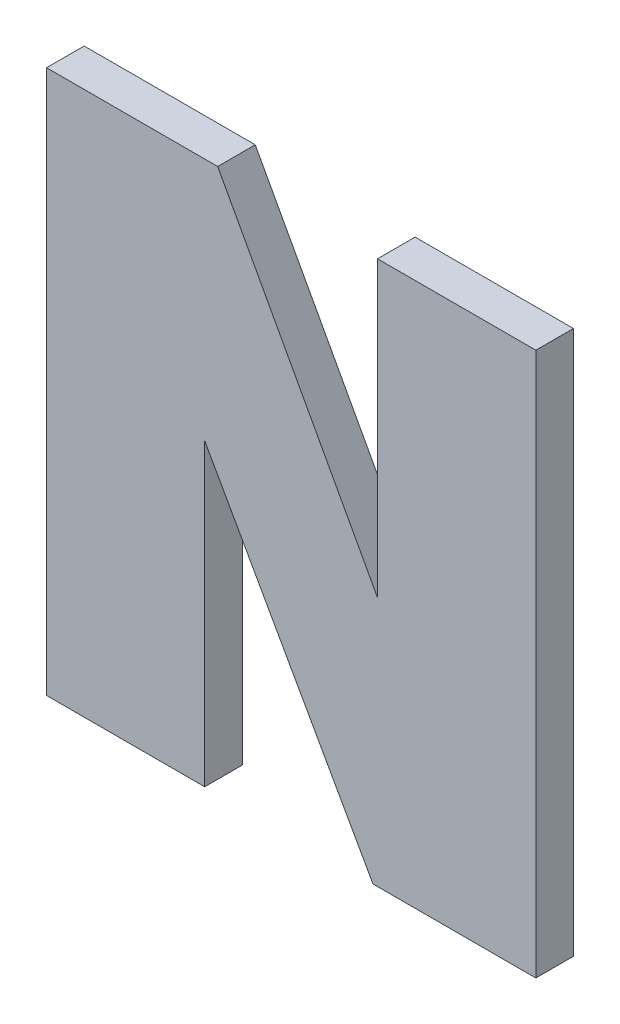
ISO-10303-21;
HEADER;
FILE_DESCRIPTION(('STEP AP214'),'2;1');
FILE_NAME('part.step','',(''),(''),'','','');
FILE_SCHEMA(('AUTOMOTIVE_DESIGN { 1 0 10303 214 1 1 1 1 }'));
ENDSEC;
DATA;
#1=APPLICATION_CONTEXT('core data for automotive mechanical design processes');
#2=APPLICATION_PROTOCOL_DEFINITION('international standard','automotive_design',2000,#1);
#3=PRODUCT_CONTEXT('',#1,'mechanical');
#4=PRODUCT('Part','Part','',(#3));
#5=PRODUCT_RELATED_PRODUCT_CATEGORY('part','',(#4));
#6=PRODUCT_DEFINITION_FORMATION('','',#4);
#7=PRODUCT_DEFINITION_CONTEXT('part definition',#1,'design');
#8=PRODUCT_DEFINITION('design','',#6,#7);
#9=PRODUCT_DEFINITION_SHAPE('','',#8);
#10=(LENGTH_UNIT() NAMED_UNIT(*) SI_UNIT(.MILLI.,.METRE.));
#11=(NAMED_UNIT(*) PLANE_ANGLE_UNIT() SI_UNIT($,.RADIAN.));
#12=(NAMED_UNIT(*) SI_UNIT($,.STERADIAN.) SOLID_ANGLE_UNIT());
#13=UNCERTAINTY_MEASURE_WITH_UNIT(LENGTH_MEASURE(1.E-05),#10,'distance_accuracy_value','');
#14=(GEOMETRIC_REPRESENTATION_CONTEXT(3) GLOBAL_UNCERTAINTY_ASSIGNED_CONTEXT((#13)) GLOBAL_UNIT_ASSIGNED_CONTEXT((#10,
#11,#12)) REPRESENTATION_CONTEXT('',''));
#15=CARTESIAN_POINT('',(0.,0.,0.));
#16=DIRECTION('',(0.,0.,1.));
#17=DIRECTION('',(1.,0.,0.));
#18=AXIS2_PLACEMENT_3D('',#15,#16,#17);
#19=CARTESIAN_POINT('',(0.,0.,0.));
#20=DIRECTION('',(0.,0.,1.));
#21=DIRECTION('',(1.,0.,0.));
#22=AXIS2_PLACEMENT_3D('',#19,#20,#21);
#23=PLANE('',#22);
#24=DIRECTION('',(0.,1.,0.));
#25=VECTOR('',#24,1.);
#26=CARTESIAN_POINT('',(6.367018,0.654558,0.));
#27=LINE('',#26,#25);
#28=CARTESIAN_POINT('',(6.367018,0.654558,0.));
#29=VERTEX_POINT('',#28);
#30=CARTESIAN_POINT('',(6.367018,1.377696,0.));
#31=VERTEX_POINT('',#30);
#32=EDGE_CURVE('E140',#29,#31,#27,.T.);
#33=ORIENTED_EDGE('',*,*,#32,.F.);
#34=DIRECTION('',(1.,0.,0.));
#35=VECTOR('',#34,1.);
#36=CARTESIAN_POINT('',(6.150356,0.654558,0.));
#37=LINE('',#36,#35);
#38=CARTESIAN_POINT('',(6.15035599999994,0.654557999999966,0.));
#39=VERTEX_POINT('',#38);
#40=EDGE_CURVE('E135',#39,#29,#37,.T.);
#41=ORIENTED_EDGE('',*,*,#40,.F.);
#42=DIRECTION('',(0.489542236970215,-0.871979585897627,0.));
#43=VECTOR('',#42,1.);
#44=CARTESIAN_POINT('',(5.926582,1.053147427262,0.));
#45=LINE('',#44,#43);
#46=CARTESIAN_POINT('',(5.926582,1.053147427262,0.));
#47=VERTEX_POINT('',#46);
#48=EDGE_CURVE('E130',#47,#39,#45,.T.);
#49=ORIENTED_EDGE('',*,*,#48,.F.);
#50=DIRECTION('',(0.,1.,0.));
#51=VECTOR('',#50,1.);
#52=CARTESIAN_POINT('',(5.926582,0.654558,0.));
#53=LINE('',#52,#51);
#54=CARTESIAN_POINT('',(5.926582,0.654558,0.));
#55=VERTEX_POINT('',#54);
#56=EDGE_CURVE('E125',#55,#47,#53,.T.);
#57=ORIENTED_EDGE('',*,*,#56,.F.);
#58=DIRECTION('',(1.,0.,0.));
#59=VECTOR('',#58,1.);
#60=CARTESIAN_POINT('',(5.71627,0.654558,0.));
#61=LINE('',#60,#59);
#62=CARTESIAN_POINT('',(5.71627,0.654558,0.));
#63=VERTEX_POINT('',#62);
#64=EDGE_CURVE('E120',#63,#55,#61,.T.);
#65=ORIENTED_EDGE('',*,*,#64,.F.);
#66=DIRECTION('',(0.,1.,0.));
#67=VECTOR('',#66,1.);
#68=CARTESIAN_POINT('',(5.71627,1.377696,0.));
#69=LINE('',#68,#67);
#70=CARTESIAN_POINT('',(5.71627,1.377696,0.));
#71=VERTEX_POINT('',#70);
#72=EDGE_CURVE('E106',#71,#63,#69,.F.);
#73=ORIENTED_EDGE('',*,*,#72,.F.);
#74=DIRECTION('',(1.,0.,0.));
#75=VECTOR('',#74,1.);
#76=CARTESIAN_POINT('',(5.943854,1.377696,0.));
#77=LINE('',#76,#75);
#78=CARTESIAN_POINT('',(5.94385400000002,1.37769600000001,0.));
#79=VERTEX_POINT('',#78);
#80=EDGE_CURVE('E91',#79,#71,#77,.F.);
#81=ORIENTED_EDGE('',*,*,#80,.F.);
#82=DIRECTION('',(-0.478286793407982,0.878203702594967,0.));
#83=VECTOR('',#82,1.);
#84=CARTESIAN_POINT('',(6.156452,0.9873353349398,0.));
#85=LINE('',#84,#83);
#86=CARTESIAN_POINT('',(6.156452,0.9873353349398,0.));
#87=VERTEX_POINT('',#86);
#88=EDGE_CURVE('E20',#87,#79,#85,.T.);
#89=ORIENTED_EDGE('',*,*,#88,.F.);
#90=DIRECTION('',(0.,1.,0.));
#91=VECTOR('',#90,1.);
#92=CARTESIAN_POINT('',(6.156452,1.377696,0.));
#93=LINE('',#92,#91);
#94=CARTESIAN_POINT('',(6.156452,1.377696,0.));
#95=VERTEX_POINT('',#94);
#96=EDGE_CURVE('E149',#95,#87,#93,.F.);
#97=ORIENTED_EDGE('',*,*,#96,.F.);
#98=DIRECTION('',(1.,0.,0.));
#99=VECTOR('',#98,1.);
#100=CARTESIAN_POINT('',(6.367018,1.377696,0.));
#101=LINE('',#100,#99);
#102=EDGE_CURVE('E145',#31,#95,#101,.F.);
#103=ORIENTED_EDGE('',*,*,#102,.F.);
#104=EDGE_LOOP('',(#33,#41,#49,#57,#65,#73,#81,#89,#97,#103));
#105=FACE_BOUND('',#104,.T.);
#106=ADVANCED_FACE('F17',(#105),#23,.F.);
#107=CARTESIAN_POINT('',(6.156452,0.9873353349398,0.));
#108=DIRECTION('',(0.878203702594967,0.478286793407982,0.));
#109=DIRECTION('',(-0.478286793407982,0.878203702594967,0.));
#110=AXIS2_PLACEMENT_3D('',#107,#108,#109);
#111=PLANE('',#110);
#112=DIRECTION('',(0.,0.,1.));
#113=VECTOR('',#112,1.);
#114=CARTESIAN_POINT('',(6.156452,0.9873353349398,0.));
#115=LINE('',#114,#113);
#116=CARTESIAN_POINT('',(6.156452,0.9873353349398,0.05));
#117=VERTEX_POINT('',#116);
#118=EDGE_CURVE('E100',#87,#117,#115,.T.);
#119=ORIENTED_EDGE('',*,*,#118,.F.);
#120=ORIENTED_EDGE('',*,*,#88,.T.);
#121=DIRECTION('',(0.,0.,1.));
#122=VECTOR('',#121,1.);
#123=CARTESIAN_POINT('',(5.943854,1.377696,0.));
#124=LINE('',#123,#122);
#125=CARTESIAN_POINT('',(5.94385400000002,1.37769600000001,0.05));
#126=VERTEX_POINT('',#125);
#127=EDGE_CURVE('E97',#126,#79,#124,.F.);
#128=ORIENTED_EDGE('',*,*,#127,.F.);
#129=DIRECTION('',(-0.47828679340805,0.878203702594931,0.));
#130=VECTOR('',#129,1.);
#131=CARTESIAN_POINT('',(6.156452,0.9873353349398,0.05));
#132=LINE('',#131,#130);
#133=EDGE_CURVE('E151',#117,#126,#132,.T.);
#134=ORIENTED_EDGE('',*,*,#133,.F.);
#135=EDGE_LOOP('',(#119,#120,#128,#134));
#136=FACE_BOUND('',#135,.T.);
#137=ADVANCED_FACE('F96',(#136),#111,.T.);
#138=CARTESIAN_POINT('',(5.943854,1.377696,0.));
#139=DIRECTION('',(0.,1.,0.));
#140=DIRECTION('',(0.,0.,1.));
#141=AXIS2_PLACEMENT_3D('',#138,#139,#140);
#142=PLANE('',#141);
#143=ORIENTED_EDGE('',*,*,#127,.T.);
#144=ORIENTED_EDGE('',*,*,#80,.T.);
#145=DIRECTION('',(0.,0.,1.));
#146=VECTOR('',#145,1.);
#147=CARTESIAN_POINT('',(5.71627,1.377696,0.));
#148=LINE('',#147,#146);
#149=CARTESIAN_POINT('',(5.71627,1.377696,0.05));
#150=VERTEX_POINT('',#149);
#151=EDGE_CURVE('E108',#150,#71,#148,.F.);
#152=ORIENTED_EDGE('',*,*,#151,.F.);
#153=DIRECTION('',(1.,0.,0.));
#154=VECTOR('',#153,1.);
#155=CARTESIAN_POINT('',(0.,1.377696,0.05));
#156=LINE('',#155,#154);
#157=EDGE_CURVE('E112',#126,#150,#156,.F.);
#158=ORIENTED_EDGE('',*,*,#157,.F.);
#159=EDGE_LOOP('',(#143,#144,#152,#158));
#160=FACE_BOUND('',#159,.T.);
#161=ADVANCED_FACE('F110',(#160),#142,.T.);
#162=CARTESIAN_POINT('',(5.71627,1.377696,0.));
#163=DIRECTION('',(-1.,0.,0.));
#164=DIRECTION('',(0.,0.,1.));
#165=AXIS2_PLACEMENT_3D('',#162,#163,#164);
#166=PLANE('',#165);
#167=ORIENTED_EDGE('',*,*,#151,.T.);
#168=ORIENTED_EDGE('',*,*,#72,.T.);
#169=DIRECTION('',(0.,0.,-1.));
#170=VECTOR('',#169,1.);
#171=CARTESIAN_POINT('',(5.71627,0.654558,0.));
#172=LINE('',#171,#170);
#173=CARTESIAN_POINT('',(5.71627,0.654558,0.05));
#174=VERTEX_POINT('',#173);
#175=EDGE_CURVE('E117',#174,#63,#172,.T.);
#176=ORIENTED_EDGE('',*,*,#175,.F.);
#177=DIRECTION('',(0.,1.,0.));
#178=VECTOR('',#177,1.);
#179=CARTESIAN_POINT('',(5.71627,0.,0.05));
#180=LINE('',#179,#178);
#181=EDGE_CURVE('E154',#150,#174,#180,.F.);
#182=ORIENTED_EDGE('',*,*,#181,.F.);
#183=EDGE_LOOP('',(#167,#168,#176,#182));
#184=FACE_BOUND('',#183,.T.);
#185=ADVANCED_FACE('F210',(#184),#166,.T.);
#186=CARTESIAN_POINT('',(5.71627,0.654558,0.));
#187=DIRECTION('',(0.,-1.,0.));
#188=DIRECTION('',(0.,0.,-1.));
#189=AXIS2_PLACEMENT_3D('',#186,#187,#188);
#190=PLANE('',#189);
#191=ORIENTED_EDGE('',*,*,#175,.T.);
#192=ORIENTED_EDGE('',*,*,#64,.T.);
#193=DIRECTION('',(0.,0.,-1.));
#194=VECTOR('',#193,1.);
#195=CARTESIAN_POINT('',(5.926582,0.654558,0.));
#196=LINE('',#195,#194);
#197=CARTESIAN_POINT('',(5.926582,0.654558,0.05));
#198=VERTEX_POINT('',#197);
#199=EDGE_CURVE('E122',#198,#55,#196,.T.);
#200=ORIENTED_EDGE('',*,*,#199,.F.);
#201=DIRECTION('',(1.,0.,0.));
#202=VECTOR('',#201,1.);
#203=CARTESIAN_POINT('',(0.,0.654558,0.05));
#204=LINE('',#203,#202);
#205=EDGE_CURVE('E157',#174,#198,#204,.T.);
#206=ORIENTED_EDGE('',*,*,#205,.F.);
#207=EDGE_LOOP('',(#191,#192,#200,#206));
#208=FACE_BOUND('',#207,.T.);
#209=ADVANCED_FACE('F206',(#208),#190,.T.);
#210=CARTESIAN_POINT('',(5.926582,0.654558,0.));
#211=DIRECTION('',(1.,0.,0.));
#212=DIRECTION('',(0.,0.,-1.));
#213=AXIS2_PLACEMENT_3D('',#210,#211,#212);
#214=PLANE('',#213);
#215=ORIENTED_EDGE('',*,*,#199,.T.);
#216=ORIENTED_EDGE('',*,*,#56,.T.);
#217=DIRECTION('',(0.,0.,1.));
#218=VECTOR('',#217,1.);
#219=CARTESIAN_POINT('',(5.926582,1.053147427262,0.));
#220=LINE('',#219,#218);
#221=CARTESIAN_POINT('',(5.926582,1.053147427262,0.05));
#222=VERTEX_POINT('',#221);
#223=EDGE_CURVE('E127',#222,#47,#220,.F.);
#224=ORIENTED_EDGE('',*,*,#223,.F.);
#225=DIRECTION('',(0.,1.,0.));
#226=VECTOR('',#225,1.);
#227=CARTESIAN_POINT('',(5.926582,0.,0.05));
#228=LINE('',#227,#226);
#229=EDGE_CURVE('E160',#198,#222,#228,.T.);
#230=ORIENTED_EDGE('',*,*,#229,.F.);
#231=EDGE_LOOP('',(#215,#216,#224,#230));
#232=FACE_BOUND('',#231,.T.);
#233=ADVANCED_FACE('F202',(#232),#214,.T.);
#234=CARTESIAN_POINT('',(5.926582,1.053147427262,0.));
#235=DIRECTION('',(-0.871979585897627,-0.489542236970215,0.));
#236=DIRECTION('',(0.489542236970215,-0.871979585897627,0.));
#237=AXIS2_PLACEMENT_3D('',#234,#235,#236);
#238=PLANE('',#237);
#239=ORIENTED_EDGE('',*,*,#223,.T.);
#240=ORIENTED_EDGE('',*,*,#48,.T.);
#241=DIRECTION('',(0.,0.,-1.));
#242=VECTOR('',#241,1.);
#243=CARTESIAN_POINT('',(6.150356,0.654558,0.));
#244=LINE('',#243,#242);
#245=CARTESIAN_POINT('',(6.15035599999994,0.654557999999966,0.05));
#246=VERTEX_POINT('',#245);
#247=EDGE_CURVE('E132',#246,#39,#244,.T.);
#248=ORIENTED_EDGE('',*,*,#247,.F.);
#249=DIRECTION('',(0.489542236970483,-0.871979585897477,0.));
#250=VECTOR('',#249,1.);
#251=CARTESIAN_POINT('',(5.926582,1.053147427262,0.05));
#252=LINE('',#251,#250);
#253=EDGE_CURVE('E163',#222,#246,#252,.T.);
#254=ORIENTED_EDGE('',*,*,#253,.F.);
#255=EDGE_LOOP('',(#239,#240,#248,#254));
#256=FACE_BOUND('',#255,.T.);
#257=ADVANCED_FACE('F198',(#256),#238,.T.);
#258=CARTESIAN_POINT('',(6.150356,0.654558,0.));
#259=DIRECTION('',(0.,-1.,0.));
#260=DIRECTION('',(0.,0.,-1.));
#261=AXIS2_PLACEMENT_3D('',#258,#259,#260);
#262=PLANE('',#261);
#263=ORIENTED_EDGE('',*,*,#247,.T.);
#264=ORIENTED_EDGE('',*,*,#40,.T.);
#265=DIRECTION('',(0.,0.,-1.));
#266=VECTOR('',#265,1.);
#267=CARTESIAN_POINT('',(6.367018,0.654558,0.));
#268=LINE('',#267,#266);
#269=CARTESIAN_POINT('',(6.367018,0.654558,0.05));
#270=VERTEX_POINT('',#269);
#271=EDGE_CURVE('E137',#270,#29,#268,.T.);
#272=ORIENTED_EDGE('',*,*,#271,.F.);
#273=DIRECTION('',(1.,0.,0.));
#274=VECTOR('',#273,1.);
#275=CARTESIAN_POINT('',(0.,0.654558,0.05));
#276=LINE('',#275,#274);
#277=EDGE_CURVE('E166',#246,#270,#276,.T.);
#278=ORIENTED_EDGE('',*,*,#277,.F.);
#279=EDGE_LOOP('',(#263,#264,#272,#278));
#280=FACE_BOUND('',#279,.T.);
#281=ADVANCED_FACE('F195',(#280),#262,.T.);
#282=CARTESIAN_POINT('',(6.367018,0.654558,0.));
#283=DIRECTION('',(1.,0.,0.));
#284=DIRECTION('',(0.,0.,-1.));
#285=AXIS2_PLACEMENT_3D('',#282,#283,#284);
#286=PLANE('',#285);
#287=ORIENTED_EDGE('',*,*,#271,.T.);
#288=ORIENTED_EDGE('',*,*,#32,.T.);
#289=DIRECTION('',(0.,0.,1.));
#290=VECTOR('',#289,1.);
#291=CARTESIAN_POINT('',(6.367018,1.377696,0.));
#292=LINE('',#291,#290);
#293=CARTESIAN_POINT('',(6.367018,1.377696,0.05));
#294=VERTEX_POINT('',#293);
#295=EDGE_CURVE('E142',#294,#31,#292,.F.);
#296=ORIENTED_EDGE('',*,*,#295,.F.);
#297=DIRECTION('',(0.,1.,0.));
#298=VECTOR('',#297,1.);
#299=CARTESIAN_POINT('',(6.367018,0.,0.05));
#300=LINE('',#299,#298);
#301=EDGE_CURVE('E169',#270,#294,#300,.T.);
#302=ORIENTED_EDGE('',*,*,#301,.F.);
#303=EDGE_LOOP('',(#287,#288,#296,#302));
#304=FACE_BOUND('',#303,.T.);
#305=ADVANCED_FACE('F179',(#304),#286,.T.);
#306=CARTESIAN_POINT('',(6.367018,1.377696,0.));
#307=DIRECTION('',(0.,1.,0.));
#308=DIRECTION('',(0.,0.,1.));
#309=AXIS2_PLACEMENT_3D('',#306,#307,#308);
#310=PLANE('',#309);
#311=ORIENTED_EDGE('',*,*,#295,.T.);
#312=ORIENTED_EDGE('',*,*,#102,.T.);
#313=DIRECTION('',(0.,0.,1.));
#314=VECTOR('',#313,1.);
#315=CARTESIAN_POINT('',(6.156452,1.377696,0.));
#316=LINE('',#315,#314);
#317=CARTESIAN_POINT('',(6.156452,1.377696,0.05));
#318=VERTEX_POINT('',#317);
#319=EDGE_CURVE('E35',#318,#95,#316,.F.);
#320=ORIENTED_EDGE('',*,*,#319,.F.);
#321=DIRECTION('',(1.,0.,0.));
#322=VECTOR('',#321,1.);
#323=CARTESIAN_POINT('',(0.,1.377696,0.05));
#324=LINE('',#323,#322);
#325=EDGE_CURVE('E26',#294,#318,#324,.F.);
#326=ORIENTED_EDGE('',*,*,#325,.F.);
#327=EDGE_LOOP('',(#311,#312,#320,#326));
#328=FACE_BOUND('',#327,.T.);
#329=ADVANCED_FACE('F176',(#328),#310,.T.);
#330=CARTESIAN_POINT('',(6.156452,1.377696,0.));
#331=DIRECTION('',(-1.,0.,0.));
#332=DIRECTION('',(0.,0.,1.));
#333=AXIS2_PLACEMENT_3D('',#330,#331,#332);
#334=PLANE('',#333);
#335=ORIENTED_EDGE('',*,*,#319,.T.);
#336=ORIENTED_EDGE('',*,*,#96,.T.);
#337=ORIENTED_EDGE('',*,*,#118,.T.);
#338=DIRECTION('',(0.,1.,0.));
#339=VECTOR('',#338,1.);
#340=CARTESIAN_POINT('',(6.156452,0.,0.05));
#341=LINE('',#340,#339);
#342=EDGE_CURVE('E11',#318,#117,#341,.F.);
#343=ORIENTED_EDGE('',*,*,#342,.F.);
#344=EDGE_LOOP('',(#335,#336,#337,#343));
#345=FACE_BOUND('',#344,.T.);
#346=ADVANCED_FACE('F182',(#345),#334,.T.);
#347=CARTESIAN_POINT('',(0.,0.,0.05));
#348=DIRECTION('',(0.,0.,1.));
#349=DIRECTION('',(1.,0.,0.));
#350=AXIS2_PLACEMENT_3D('',#347,#348,#349);
#351=PLANE('',#350);
#352=ORIENTED_EDGE('',*,*,#325,.T.);
#353=ORIENTED_EDGE('',*,*,#342,.T.);
#354=ORIENTED_EDGE('',*,*,#133,.T.);
#355=ORIENTED_EDGE('',*,*,#157,.T.);
#356=ORIENTED_EDGE('',*,*,#181,.T.);
#357=ORIENTED_EDGE('',*,*,#205,.T.);
#358=ORIENTED_EDGE('',*,*,#229,.T.);
#359=ORIENTED_EDGE('',*,*,#253,.T.);
#360=ORIENTED_EDGE('',*,*,#277,.T.);
#361=ORIENTED_EDGE('',*,*,#301,.T.);
#362=EDGE_LOOP('',(#352,#353,#354,#355,#356,#357,#358,#359,#360,#361));
#363=FACE_BOUND('',#362,.T.);
#364=ADVANCED_FACE('F174',(#363),#351,.T.);
#365=CLOSED_SHELL('',(#106,#137,#161,#185,#209,#233,#257,#281,#305,#329,#346,#364));
#366=MANIFOLD_SOLID_BREP('B1',#365);
#367=ADVANCED_BREP_SHAPE_REPRESENTATION('',(#18,#366),#14);
#368=SHAPE_DEFINITION_REPRESENTATION(#9,#367);
ENDSEC;
END-ISO-10303-21;
